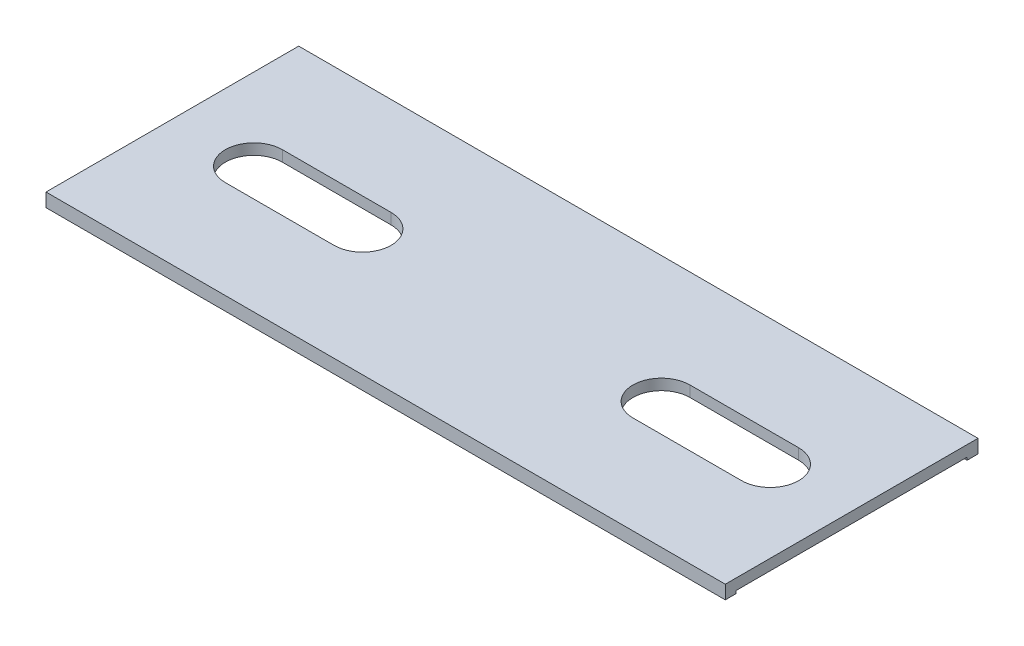
ISO-10303-21;
HEADER;
FILE_DESCRIPTION(('STEP AP214'),'2;1');
FILE_NAME('part.step','',(''),(''),'','','');
FILE_SCHEMA(('AUTOMOTIVE_DESIGN { 1 0 10303 214 1 1 1 1 }'));
ENDSEC;
DATA;
#1=APPLICATION_CONTEXT('core data for automotive mechanical design processes');
#2=APPLICATION_PROTOCOL_DEFINITION('international standard','automotive_design',2000,#1);
#3=PRODUCT_CONTEXT('',#1,'mechanical');
#4=PRODUCT('Part','Part','',(#3));
#5=PRODUCT_RELATED_PRODUCT_CATEGORY('part','',(#4));
#6=PRODUCT_DEFINITION_FORMATION('','',#4);
#7=PRODUCT_DEFINITION_CONTEXT('part definition',#1,'design');
#8=PRODUCT_DEFINITION('design','',#6,#7);
#9=PRODUCT_DEFINITION_SHAPE('','',#8);
#10=(LENGTH_UNIT() NAMED_UNIT(*) SI_UNIT(.MILLI.,.METRE.));
#11=(NAMED_UNIT(*) PLANE_ANGLE_UNIT() SI_UNIT($,.RADIAN.));
#12=(NAMED_UNIT(*) SI_UNIT($,.STERADIAN.) SOLID_ANGLE_UNIT());
#13=UNCERTAINTY_MEASURE_WITH_UNIT(LENGTH_MEASURE(1.E-05),#10,'distance_accuracy_value','');
#14=(GEOMETRIC_REPRESENTATION_CONTEXT(3) GLOBAL_UNCERTAINTY_ASSIGNED_CONTEXT((#13)) GLOBAL_UNIT_ASSIGNED_CONTEXT((#10,
#11,#12)) REPRESENTATION_CONTEXT('',''));
#15=CARTESIAN_POINT('',(0.,0.,0.));
#16=DIRECTION('',(0.,0.,1.));
#17=DIRECTION('',(1.,0.,0.));
#18=AXIS2_PLACEMENT_3D('',#15,#16,#17);
#19=CARTESIAN_POINT('',(63.5,0.,0.));
#20=DIRECTION('',(0.,0.,-1.));
#21=DIRECTION('',(0.,1.,0.));
#22=AXIS2_PLACEMENT_3D('',#19,#20,#21);
#23=PLANE('',#22);
#24=DIRECTION('',(0.,-1.,0.));
#25=VECTOR('',#24,1.);
#26=CARTESIAN_POINT('',(0.,0.,0.));
#27=LINE('',#26,#25);
#28=CARTESIAN_POINT('',(0.,0.,0.));
#29=VERTEX_POINT('',#28);
#30=CARTESIAN_POINT('',(0.,-1.27,0.));
#31=VERTEX_POINT('',#30);
#32=EDGE_CURVE('E252',#29,#31,#27,.T.);
#33=ORIENTED_EDGE('',*,*,#32,.T.);
#34=DIRECTION('',(-1.,0.,0.));
#35=VECTOR('',#34,1.);
#36=CARTESIAN_POINT('',(63.5,-1.27,0.));
#37=LINE('',#36,#35);
#38=CARTESIAN_POINT('',(63.5,-1.27,0.));
#39=VERTEX_POINT('',#38);
#40=EDGE_CURVE('E11',#39,#31,#37,.T.);
#41=ORIENTED_EDGE('',*,*,#40,.F.);
#42=DIRECTION('',(0.,-1.,0.));
#43=VECTOR('',#42,1.);
#44=CARTESIAN_POINT('',(63.5,0.,0.));
#45=LINE('',#44,#43);
#46=CARTESIAN_POINT('',(63.5,0.,0.));
#47=VERTEX_POINT('',#46);
#48=EDGE_CURVE('E255',#47,#39,#45,.T.);
#49=ORIENTED_EDGE('',*,*,#48,.F.);
#50=DIRECTION('',(-1.,0.,0.));
#51=VECTOR('',#50,1.);
#52=CARTESIAN_POINT('',(63.5,0.,0.));
#53=LINE('',#52,#51);
#54=EDGE_CURVE('E277',#47,#29,#53,.T.);
#55=ORIENTED_EDGE('',*,*,#54,.T.);
#56=EDGE_LOOP('',(#33,#41,#49,#55));
#57=FACE_BOUND('',#56,.T.);
#58=ADVANCED_FACE('F44',(#57),#23,.F.);
#59=CARTESIAN_POINT('',(63.5,-1.27,0.));
#60=DIRECTION('',(0.,1.,0.));
#61=DIRECTION('',(0.,0.,1.));
#62=AXIS2_PLACEMENT_3D('',#59,#60,#61);
#63=PLANE('',#62);
#64=DIRECTION('',(0.,0.,-1.));
#65=VECTOR('',#64,1.);
#66=CARTESIAN_POINT('',(0.,-1.27,0.));
#67=LINE('',#66,#65);
#68=CARTESIAN_POINT('',(0.,-1.27,-1.016));
#69=VERTEX_POINT('',#68);
#70=EDGE_CURVE('E285',#31,#69,#67,.T.);
#71=ORIENTED_EDGE('',*,*,#70,.T.);
#72=DIRECTION('',(-1.,0.,0.));
#73=VECTOR('',#72,1.);
#74=CARTESIAN_POINT('',(63.5,-1.27,-1.016));
#75=LINE('',#74,#73);
#76=CARTESIAN_POINT('',(63.5,-1.27,-1.016));
#77=VERTEX_POINT('',#76);
#78=EDGE_CURVE('E52',#77,#69,#75,.T.);
#79=ORIENTED_EDGE('',*,*,#78,.F.);
#80=DIRECTION('',(0.,0.,-1.));
#81=VECTOR('',#80,1.);
#82=CARTESIAN_POINT('',(63.5,-1.27,0.));
#83=LINE('',#82,#81);
#84=EDGE_CURVE('E258',#39,#77,#83,.T.);
#85=ORIENTED_EDGE('',*,*,#84,.F.);
#86=ORIENTED_EDGE('',*,*,#40,.T.);
#87=EDGE_LOOP('',(#71,#79,#85,#86));
#88=FACE_BOUND('',#87,.T.);
#89=ADVANCED_FACE('F351',(#88),#63,.F.);
#90=CARTESIAN_POINT('',(63.5,-1.27,-1.016));
#91=DIRECTION('',(0.,0.,1.));
#92=DIRECTION('',(1.,0.,0.));
#93=AXIS2_PLACEMENT_3D('',#90,#91,#92);
#94=PLANE('',#93);
#95=DIRECTION('',(0.,1.,0.));
#96=VECTOR('',#95,1.);
#97=CARTESIAN_POINT('',(0.,-1.27,-1.016));
#98=LINE('',#97,#96);
#99=CARTESIAN_POINT('',(0.,-1.016,-1.016));
#100=VERTEX_POINT('',#99);
#101=EDGE_CURVE('E283',#69,#100,#98,.T.);
#102=ORIENTED_EDGE('',*,*,#101,.T.);
#103=DIRECTION('',(-1.,0.,0.));
#104=VECTOR('',#103,1.);
#105=CARTESIAN_POINT('',(63.5,-1.016,-1.016));
#106=LINE('',#105,#104);
#107=CARTESIAN_POINT('',(63.5,-1.016,-1.016));
#108=VERTEX_POINT('',#107);
#109=EDGE_CURVE('E321',#108,#100,#106,.T.);
#110=ORIENTED_EDGE('',*,*,#109,.F.);
#111=DIRECTION('',(0.,1.,0.));
#112=VECTOR('',#111,1.);
#113=CARTESIAN_POINT('',(63.5,-1.27,-1.016));
#114=LINE('',#113,#112);
#115=EDGE_CURVE('E259',#77,#108,#114,.T.);
#116=ORIENTED_EDGE('',*,*,#115,.F.);
#117=ORIENTED_EDGE('',*,*,#78,.T.);
#118=EDGE_LOOP('',(#102,#110,#116,#117));
#119=FACE_BOUND('',#118,.T.);
#120=ADVANCED_FACE('F328',(#119),#94,.F.);
#121=CARTESIAN_POINT('',(63.5,-1.016,-1.016));
#122=DIRECTION('',(0.,1.,0.));
#123=DIRECTION('',(0.,0.,1.));
#124=AXIS2_PLACEMENT_3D('',#121,#122,#123);
#125=PLANE('',#124);
#126=DIRECTION('',(-1.,0.,0.));
#127=VECTOR('',#126,1.);
#128=CARTESIAN_POINT('',(63.5,-1.016,-14.478));
#129=LINE('',#128,#127);
#130=CARTESIAN_POINT('',(17.78,-1.016,-14.478));
#131=VERTEX_POINT('',#130);
#132=CARTESIAN_POINT('',(7.62,-1.016,-14.478));
#133=VERTEX_POINT('',#132);
#134=EDGE_CURVE('E243',#131,#133,#129,.T.);
#135=ORIENTED_EDGE('',*,*,#134,.T.);
#136=CARTESIAN_POINT('',(7.62,-1.016,-11.811));
#137=DIRECTION('',(0.,1.,0.));
#138=DIRECTION('',(0.,0.,1.));
#139=AXIS2_PLACEMENT_3D('',#136,#137,#138);
#140=CIRCLE('',#139,2.667);
#141=CARTESIAN_POINT('',(7.62,-1.016,-9.144));
#142=VERTEX_POINT('',#141);
#143=EDGE_CURVE('E250',#133,#142,#140,.T.);
#144=ORIENTED_EDGE('',*,*,#143,.T.);
#145=DIRECTION('',(1.,0.,0.));
#146=VECTOR('',#145,1.);
#147=CARTESIAN_POINT('',(63.5,-1.016,-9.144));
#148=LINE('',#147,#146);
#149=CARTESIAN_POINT('',(17.78,-1.016,-9.144));
#150=VERTEX_POINT('',#149);
#151=EDGE_CURVE('E239',#142,#150,#148,.T.);
#152=ORIENTED_EDGE('',*,*,#151,.T.);
#153=CARTESIAN_POINT('',(17.78,-1.016,-11.811));
#154=DIRECTION('',(0.,1.,0.));
#155=DIRECTION('',(0.,0.,1.));
#156=AXIS2_PLACEMENT_3D('',#153,#154,#155);
#157=CIRCLE('',#156,2.667);
#158=EDGE_CURVE('E163',#150,#131,#157,.T.);
#159=ORIENTED_EDGE('',*,*,#158,.T.);
#160=EDGE_LOOP('',(#135,#144,#152,#159));
#161=FACE_BOUND('',#160,.T.);
#162=DIRECTION('',(-1.,0.,0.));
#163=VECTOR('',#162,1.);
#164=CARTESIAN_POINT('',(63.5,-1.016,-14.478));
#165=LINE('',#164,#163);
#166=CARTESIAN_POINT('',(55.88,-1.016,-14.478));
#167=VERTEX_POINT('',#166);
#168=CARTESIAN_POINT('',(45.72,-1.016,-14.478));
#169=VERTEX_POINT('',#168);
#170=EDGE_CURVE('E229',#167,#169,#165,.T.);
#171=ORIENTED_EDGE('',*,*,#170,.T.);
#172=CARTESIAN_POINT('',(45.72,-1.016,-11.811));
#173=DIRECTION('',(0.,1.,0.));
#174=DIRECTION('',(0.,0.,1.));
#175=AXIS2_PLACEMENT_3D('',#172,#173,#174);
#176=CIRCLE('',#175,2.667);
#177=CARTESIAN_POINT('',(45.72,-1.016,-9.144));
#178=VERTEX_POINT('',#177);
#179=EDGE_CURVE('E233',#169,#178,#176,.T.);
#180=ORIENTED_EDGE('',*,*,#179,.T.);
#181=DIRECTION('',(1.,0.,0.));
#182=VECTOR('',#181,1.);
#183=CARTESIAN_POINT('',(63.5,-1.016,-9.144));
#184=LINE('',#183,#182);
#185=CARTESIAN_POINT('',(55.88,-1.016,-9.144));
#186=VERTEX_POINT('',#185);
#187=EDGE_CURVE('E195',#178,#186,#184,.T.);
#188=ORIENTED_EDGE('',*,*,#187,.T.);
#189=CARTESIAN_POINT('',(55.88,-1.016,-11.811));
#190=DIRECTION('',(0.,1.,0.));
#191=DIRECTION('',(0.,0.,1.));
#192=AXIS2_PLACEMENT_3D('',#189,#190,#191);
#193=CIRCLE('',#192,2.667);
#194=EDGE_CURVE('E226',#186,#167,#193,.T.);
#195=ORIENTED_EDGE('',*,*,#194,.T.);
#196=EDGE_LOOP('',(#171,#180,#188,#195));
#197=FACE_BOUND('',#196,.T.);
#198=DIRECTION('',(0.,0.,-1.));
#199=VECTOR('',#198,1.);
#200=CARTESIAN_POINT('',(0.,-1.016,-1.016));
#201=LINE('',#200,#199);
#202=CARTESIAN_POINT('',(0.,-1.016,-22.606));
#203=VERTEX_POINT('',#202);
#204=EDGE_CURVE('E288',#100,#203,#201,.T.);
#205=ORIENTED_EDGE('',*,*,#204,.T.);
#206=DIRECTION('',(-1.,0.,0.));
#207=VECTOR('',#206,1.);
#208=CARTESIAN_POINT('',(63.5,-1.016,-22.606));
#209=LINE('',#208,#207);
#210=CARTESIAN_POINT('',(63.5,-1.016,-22.606));
#211=VERTEX_POINT('',#210);
#212=EDGE_CURVE('E320',#211,#203,#209,.T.);
#213=ORIENTED_EDGE('',*,*,#212,.F.);
#214=DIRECTION('',(0.,0.,-1.));
#215=VECTOR('',#214,1.);
#216=CARTESIAN_POINT('',(63.5,-1.016,-1.016));
#217=LINE('',#216,#215);
#218=EDGE_CURVE('E261',#108,#211,#217,.T.);
#219=ORIENTED_EDGE('',*,*,#218,.F.);
#220=ORIENTED_EDGE('',*,*,#109,.T.);
#221=EDGE_LOOP('',(#205,#213,#219,#220));
#222=FACE_BOUND('',#221,.T.);
#223=ADVANCED_FACE('F342',(#161,#197,#222),#125,.F.);
#224=CARTESIAN_POINT('',(63.5,-1.016,-22.606));
#225=DIRECTION('',(0.,0.,-1.));
#226=DIRECTION('',(-1.,0.,0.));
#227=AXIS2_PLACEMENT_3D('',#224,#225,#226);
#228=PLANE('',#227);
#229=DIRECTION('',(0.,-1.,0.));
#230=VECTOR('',#229,1.);
#231=CARTESIAN_POINT('',(0.,-1.016,-22.606));
#232=LINE('',#231,#230);
#233=CARTESIAN_POINT('',(0.,-1.27,-22.606));
#234=VERTEX_POINT('',#233);
#235=EDGE_CURVE('E292',#203,#234,#232,.T.);
#236=ORIENTED_EDGE('',*,*,#235,.T.);
#237=DIRECTION('',(-1.,0.,0.));
#238=VECTOR('',#237,1.);
#239=CARTESIAN_POINT('',(63.5,-1.27,-22.606));
#240=LINE('',#239,#238);
#241=CARTESIAN_POINT('',(63.5,-1.27,-22.606));
#242=VERTEX_POINT('',#241);
#243=EDGE_CURVE('E313',#242,#234,#240,.T.);
#244=ORIENTED_EDGE('',*,*,#243,.F.);
#245=DIRECTION('',(0.,-1.,0.));
#246=VECTOR('',#245,1.);
#247=CARTESIAN_POINT('',(63.5,-1.016,-22.606));
#248=LINE('',#247,#246);
#249=EDGE_CURVE('E266',#211,#242,#248,.T.);
#250=ORIENTED_EDGE('',*,*,#249,.F.);
#251=ORIENTED_EDGE('',*,*,#212,.T.);
#252=EDGE_LOOP('',(#236,#244,#250,#251));
#253=FACE_BOUND('',#252,.T.);
#254=ADVANCED_FACE('F341',(#253),#228,.F.);
#255=CARTESIAN_POINT('',(63.5,-1.27,-22.606));
#256=DIRECTION('',(0.,1.,0.));
#257=DIRECTION('',(0.,0.,1.));
#258=AXIS2_PLACEMENT_3D('',#255,#256,#257);
#259=PLANE('',#258);
#260=DIRECTION('',(0.,0.,-1.));
#261=VECTOR('',#260,1.);
#262=CARTESIAN_POINT('',(0.,-1.27,-22.606));
#263=LINE('',#262,#261);
#264=CARTESIAN_POINT('',(0.,-1.27,-23.622));
#265=VERTEX_POINT('',#264);
#266=EDGE_CURVE('E294',#234,#265,#263,.T.);
#267=ORIENTED_EDGE('',*,*,#266,.T.);
#268=DIRECTION('',(-1.,0.,0.));
#269=VECTOR('',#268,1.);
#270=CARTESIAN_POINT('',(63.5,-1.27,-23.622));
#271=LINE('',#270,#269);
#272=CARTESIAN_POINT('',(63.5,-1.27,-23.622));
#273=VERTEX_POINT('',#272);
#274=EDGE_CURVE('E309',#273,#265,#271,.T.);
#275=ORIENTED_EDGE('',*,*,#274,.F.);
#276=DIRECTION('',(0.,0.,-1.));
#277=VECTOR('',#276,1.);
#278=CARTESIAN_POINT('',(63.5,-1.27,-22.606));
#279=LINE('',#278,#277);
#280=EDGE_CURVE('E267',#242,#273,#279,.T.);
#281=ORIENTED_EDGE('',*,*,#280,.F.);
#282=ORIENTED_EDGE('',*,*,#243,.T.);
#283=EDGE_LOOP('',(#267,#275,#281,#282));
#284=FACE_BOUND('',#283,.T.);
#285=ADVANCED_FACE('F364',(#284),#259,.F.);
#286=CARTESIAN_POINT('',(63.5,0.,-23.622));
#287=DIRECTION('',(0.,0.,1.));
#288=DIRECTION('',(1.,0.,0.));
#289=AXIS2_PLACEMENT_3D('',#286,#287,#288);
#290=PLANE('',#289);
#291=DIRECTION('',(0.,1.,0.));
#292=VECTOR('',#291,1.);
#293=CARTESIAN_POINT('',(0.,0.,-23.622));
#294=LINE('',#293,#292);
#295=CARTESIAN_POINT('',(0.,0.,-23.622));
#296=VERTEX_POINT('',#295);
#297=EDGE_CURVE('E300',#265,#296,#294,.T.);
#298=ORIENTED_EDGE('',*,*,#297,.T.);
#299=DIRECTION('',(-1.,0.,0.));
#300=VECTOR('',#299,1.);
#301=CARTESIAN_POINT('',(63.5,0.,-23.622));
#302=LINE('',#301,#300);
#303=CARTESIAN_POINT('',(63.5,0.,-23.622));
#304=VERTEX_POINT('',#303);
#305=EDGE_CURVE('E304',#304,#296,#302,.T.);
#306=ORIENTED_EDGE('',*,*,#305,.F.);
#307=DIRECTION('',(0.,1.,0.));
#308=VECTOR('',#307,1.);
#309=CARTESIAN_POINT('',(63.5,0.,-23.622));
#310=LINE('',#309,#308);
#311=EDGE_CURVE('E275',#273,#304,#310,.T.);
#312=ORIENTED_EDGE('',*,*,#311,.F.);
#313=ORIENTED_EDGE('',*,*,#274,.T.);
#314=EDGE_LOOP('',(#298,#306,#312,#313));
#315=FACE_BOUND('',#314,.T.);
#316=ADVANCED_FACE('F363',(#315),#290,.F.);
#317=CARTESIAN_POINT('',(63.5,0.,0.));
#318=DIRECTION('',(0.,-1.,0.));
#319=DIRECTION('',(0.,0.,-1.));
#320=AXIS2_PLACEMENT_3D('',#317,#318,#319);
#321=PLANE('',#320);
#322=DIRECTION('',(1.,0.,0.));
#323=VECTOR('',#322,1.);
#324=CARTESIAN_POINT('',(7.62,0.,-9.144));
#325=LINE('',#324,#323);
#326=CARTESIAN_POINT('',(7.62,0.,-9.144));
#327=VERTEX_POINT('',#326);
#328=CARTESIAN_POINT('',(17.78,0.,-9.144));
#329=VERTEX_POINT('',#328);
#330=EDGE_CURVE('E173',#327,#329,#325,.T.);
#331=ORIENTED_EDGE('',*,*,#330,.F.);
#332=CARTESIAN_POINT('',(7.62,0.,-11.811));
#333=DIRECTION('',(0.,1.,0.));
#334=DIRECTION('',(0.,0.,1.));
#335=AXIS2_PLACEMENT_3D('',#332,#333,#334);
#336=CIRCLE('',#335,2.667);
#337=CARTESIAN_POINT('',(7.62,0.,-14.478));
#338=VERTEX_POINT('',#337);
#339=EDGE_CURVE('E180',#338,#327,#336,.T.);
#340=ORIENTED_EDGE('',*,*,#339,.F.);
#341=DIRECTION('',(-1.,0.,0.));
#342=VECTOR('',#341,1.);
#343=CARTESIAN_POINT('',(7.62,0.,-14.478));
#344=LINE('',#343,#342);
#345=CARTESIAN_POINT('',(17.78,0.,-14.478));
#346=VERTEX_POINT('',#345);
#347=EDGE_CURVE('E185',#346,#338,#344,.T.);
#348=ORIENTED_EDGE('',*,*,#347,.F.);
#349=CARTESIAN_POINT('',(17.78,0.,-11.811));
#350=DIRECTION('',(0.,1.,0.));
#351=DIRECTION('',(0.,0.,1.));
#352=AXIS2_PLACEMENT_3D('',#349,#350,#351);
#353=CIRCLE('',#352,2.667);
#354=EDGE_CURVE('E158',#329,#346,#353,.T.);
#355=ORIENTED_EDGE('',*,*,#354,.F.);
#356=EDGE_LOOP('',(#331,#340,#348,#355));
#357=FACE_BOUND('',#356,.T.);
#358=DIRECTION('',(1.,0.,0.));
#359=VECTOR('',#358,1.);
#360=CARTESIAN_POINT('',(45.72,0.,-9.144));
#361=LINE('',#360,#359);
#362=CARTESIAN_POINT('',(45.72,0.,-9.144));
#363=VERTEX_POINT('',#362);
#364=CARTESIAN_POINT('',(55.88,0.,-9.144));
#365=VERTEX_POINT('',#364);
#366=EDGE_CURVE('E220',#363,#365,#361,.T.);
#367=ORIENTED_EDGE('',*,*,#366,.F.);
#368=CARTESIAN_POINT('',(45.72,0.,-11.811));
#369=DIRECTION('',(0.,1.,0.));
#370=DIRECTION('',(0.,0.,1.));
#371=AXIS2_PLACEMENT_3D('',#368,#369,#370);
#372=CIRCLE('',#371,2.667);
#373=CARTESIAN_POINT('',(45.72,0.,-14.478));
#374=VERTEX_POINT('',#373);
#375=EDGE_CURVE('E217',#374,#363,#372,.T.);
#376=ORIENTED_EDGE('',*,*,#375,.F.);
#377=DIRECTION('',(-1.,0.,0.));
#378=VECTOR('',#377,1.);
#379=CARTESIAN_POINT('',(45.72,0.,-14.478));
#380=LINE('',#379,#378);
#381=CARTESIAN_POINT('',(55.88,0.,-14.478));
#382=VERTEX_POINT('',#381);
#383=EDGE_CURVE('E202',#382,#374,#380,.T.);
#384=ORIENTED_EDGE('',*,*,#383,.F.);
#385=CARTESIAN_POINT('',(55.88,0.,-11.811));
#386=DIRECTION('',(0.,1.,0.));
#387=DIRECTION('',(0.,0.,1.));
#388=AXIS2_PLACEMENT_3D('',#385,#386,#387);
#389=CIRCLE('',#388,2.667);
#390=EDGE_CURVE('E211',#365,#382,#389,.T.);
#391=ORIENTED_EDGE('',*,*,#390,.F.);
#392=EDGE_LOOP('',(#367,#376,#384,#391));
#393=FACE_BOUND('',#392,.T.);
#394=DIRECTION('',(0.,0.,1.));
#395=VECTOR('',#394,1.);
#396=CARTESIAN_POINT('',(0.,0.,0.));
#397=LINE('',#396,#395);
#398=EDGE_CURVE('E257',#296,#29,#397,.T.);
#399=ORIENTED_EDGE('',*,*,#398,.T.);
#400=ORIENTED_EDGE('',*,*,#54,.F.);
#401=DIRECTION('',(0.,0.,1.));
#402=VECTOR('',#401,1.);
#403=CARTESIAN_POINT('',(63.5,0.,0.));
#404=LINE('',#403,#402);
#405=EDGE_CURVE('E274',#304,#47,#404,.T.);
#406=ORIENTED_EDGE('',*,*,#405,.F.);
#407=ORIENTED_EDGE('',*,*,#305,.T.);
#408=EDGE_LOOP('',(#399,#400,#406,#407));
#409=FACE_BOUND('',#408,.T.);
#410=ADVANCED_FACE('F177',(#357,#393,#409),#321,.F.);
#411=CARTESIAN_POINT('',(63.5,0.,0.));
#412=DIRECTION('',(1.,0.,0.));
#413=DIRECTION('',(0.,0.,-1.));
#414=AXIS2_PLACEMENT_3D('',#411,#412,#413);
#415=PLANE('',#414);
#416=ORIENTED_EDGE('',*,*,#48,.T.);
#417=ORIENTED_EDGE('',*,*,#84,.T.);
#418=ORIENTED_EDGE('',*,*,#115,.T.);
#419=ORIENTED_EDGE('',*,*,#218,.T.);
#420=ORIENTED_EDGE('',*,*,#249,.T.);
#421=ORIENTED_EDGE('',*,*,#280,.T.);
#422=ORIENTED_EDGE('',*,*,#311,.T.);
#423=ORIENTED_EDGE('',*,*,#405,.T.);
#424=EDGE_LOOP('',(#416,#417,#418,#419,#420,#421,#422,#423));
#425=FACE_BOUND('',#424,.T.);
#426=ADVANCED_FACE('F350',(#425),#415,.T.);
#427=CARTESIAN_POINT('',(0.,0.,0.));
#428=DIRECTION('',(1.,0.,0.));
#429=DIRECTION('',(0.,0.,-1.));
#430=AXIS2_PLACEMENT_3D('',#427,#428,#429);
#431=PLANE('',#430);
#432=ORIENTED_EDGE('',*,*,#32,.F.);
#433=ORIENTED_EDGE('',*,*,#398,.F.);
#434=ORIENTED_EDGE('',*,*,#297,.F.);
#435=ORIENTED_EDGE('',*,*,#266,.F.);
#436=ORIENTED_EDGE('',*,*,#235,.F.);
#437=ORIENTED_EDGE('',*,*,#204,.F.);
#438=ORIENTED_EDGE('',*,*,#101,.F.);
#439=ORIENTED_EDGE('',*,*,#70,.F.);
#440=EDGE_LOOP('',(#432,#433,#434,#435,#436,#437,#438,#439));
#441=FACE_BOUND('',#440,.T.);
#442=ADVANCED_FACE('F337',(#441),#431,.F.);
#443=CARTESIAN_POINT('',(45.72,-1.27,-11.811));
#444=DIRECTION('',(0.,1.,0.));
#445=DIRECTION('',(0.,0.,1.));
#446=AXIS2_PLACEMENT_3D('',#443,#444,#445);
#447=CYLINDRICAL_SURFACE('',#446,2.667);
#448=DIRECTION('',(0.,1.,0.));
#449=VECTOR('',#448,1.);
#450=CARTESIAN_POINT('',(45.72,-1.27,-14.478));
#451=LINE('',#450,#449);
#452=EDGE_CURVE('E210',#169,#374,#451,.T.);
#453=ORIENTED_EDGE('',*,*,#452,.T.);
#454=ORIENTED_EDGE('',*,*,#375,.T.);
#455=DIRECTION('',(0.,1.,0.));
#456=VECTOR('',#455,1.);
#457=CARTESIAN_POINT('',(45.72,-1.27,-9.144));
#458=LINE('',#457,#456);
#459=EDGE_CURVE('E200',#178,#363,#458,.T.);
#460=ORIENTED_EDGE('',*,*,#459,.F.);
#461=ORIENTED_EDGE('',*,*,#179,.F.);
#462=EDGE_LOOP('',(#453,#454,#460,#461));
#463=FACE_BOUND('',#462,.T.);
#464=ADVANCED_FACE('F405',(#463),#447,.F.);
#465=CARTESIAN_POINT('',(45.72,-1.27,-14.478));
#466=DIRECTION('',(0.,0.,-1.));
#467=DIRECTION('',(-1.,0.,0.));
#468=AXIS2_PLACEMENT_3D('',#465,#466,#467);
#469=PLANE('',#468);
#470=DIRECTION('',(0.,1.,0.));
#471=VECTOR('',#470,1.);
#472=CARTESIAN_POINT('',(55.88,-1.27,-14.478));
#473=LINE('',#472,#471);
#474=EDGE_CURVE('E204',#167,#382,#473,.T.);
#475=ORIENTED_EDGE('',*,*,#474,.T.);
#476=ORIENTED_EDGE('',*,*,#383,.T.);
#477=ORIENTED_EDGE('',*,*,#452,.F.);
#478=ORIENTED_EDGE('',*,*,#170,.F.);
#479=EDGE_LOOP('',(#475,#476,#477,#478));
#480=FACE_BOUND('',#479,.T.);
#481=ADVANCED_FACE('F391',(#480),#469,.F.);
#482=CARTESIAN_POINT('',(55.88,-1.27,-11.811));
#483=DIRECTION('',(0.,1.,0.));
#484=DIRECTION('',(0.,0.,1.));
#485=AXIS2_PLACEMENT_3D('',#482,#483,#484);
#486=CYLINDRICAL_SURFACE('',#485,2.667);
#487=DIRECTION('',(0.,1.,0.));
#488=VECTOR('',#487,1.);
#489=CARTESIAN_POINT('',(55.88,-1.27,-9.144));
#490=LINE('',#489,#488);
#491=EDGE_CURVE('E66',#186,#365,#490,.T.);
#492=ORIENTED_EDGE('',*,*,#491,.T.);
#493=ORIENTED_EDGE('',*,*,#390,.T.);
#494=ORIENTED_EDGE('',*,*,#474,.F.);
#495=ORIENTED_EDGE('',*,*,#194,.F.);
#496=EDGE_LOOP('',(#492,#493,#494,#495));
#497=FACE_BOUND('',#496,.T.);
#498=ADVANCED_FACE('F394',(#497),#486,.F.);
#499=CARTESIAN_POINT('',(45.72,-1.27,-9.144));
#500=DIRECTION('',(0.,0.,1.));
#501=DIRECTION('',(1.,0.,0.));
#502=AXIS2_PLACEMENT_3D('',#499,#500,#501);
#503=PLANE('',#502);
#504=ORIENTED_EDGE('',*,*,#459,.T.);
#505=ORIENTED_EDGE('',*,*,#366,.T.);
#506=ORIENTED_EDGE('',*,*,#491,.F.);
#507=ORIENTED_EDGE('',*,*,#187,.F.);
#508=EDGE_LOOP('',(#504,#505,#506,#507));
#509=FACE_BOUND('',#508,.T.);
#510=ADVANCED_FACE('F403',(#509),#503,.F.);
#511=CARTESIAN_POINT('',(7.62,-1.27,-11.811));
#512=DIRECTION('',(0.,1.,0.));
#513=DIRECTION('',(0.,0.,1.));
#514=AXIS2_PLACEMENT_3D('',#511,#512,#513);
#515=CYLINDRICAL_SURFACE('',#514,2.667);
#516=DIRECTION('',(0.,1.,0.));
#517=VECTOR('',#516,1.);
#518=CARTESIAN_POINT('',(7.62,-1.27,-14.478));
#519=LINE('',#518,#517);
#520=EDGE_CURVE('E188',#133,#338,#519,.T.);
#521=ORIENTED_EDGE('',*,*,#520,.T.);
#522=ORIENTED_EDGE('',*,*,#339,.T.);
#523=DIRECTION('',(0.,1.,0.));
#524=VECTOR('',#523,1.);
#525=CARTESIAN_POINT('',(7.62,-1.27,-9.144));
#526=LINE('',#525,#524);
#527=EDGE_CURVE('E167',#142,#327,#526,.T.);
#528=ORIENTED_EDGE('',*,*,#527,.F.);
#529=ORIENTED_EDGE('',*,*,#143,.F.);
#530=EDGE_LOOP('',(#521,#522,#528,#529));
#531=FACE_BOUND('',#530,.T.);
#532=ADVANCED_FACE('F404',(#531),#515,.F.);
#533=CARTESIAN_POINT('',(7.62,-1.27,-14.478));
#534=DIRECTION('',(0.,0.,-1.));
#535=DIRECTION('',(-1.,0.,0.));
#536=AXIS2_PLACEMENT_3D('',#533,#534,#535);
#537=PLANE('',#536);
#538=DIRECTION('',(0.,1.,0.));
#539=VECTOR('',#538,1.);
#540=CARTESIAN_POINT('',(17.78,-1.27,-14.478));
#541=LINE('',#540,#539);
#542=EDGE_CURVE('E168',#131,#346,#541,.T.);
#543=ORIENTED_EDGE('',*,*,#542,.T.);
#544=ORIENTED_EDGE('',*,*,#347,.T.);
#545=ORIENTED_EDGE('',*,*,#520,.F.);
#546=ORIENTED_EDGE('',*,*,#134,.F.);
#547=EDGE_LOOP('',(#543,#544,#545,#546));
#548=FACE_BOUND('',#547,.T.);
#549=ADVANCED_FACE('F411',(#548),#537,.F.);
#550=CARTESIAN_POINT('',(17.78,-1.27,-11.811));
#551=DIRECTION('',(0.,1.,0.));
#552=DIRECTION('',(0.,0.,1.));
#553=AXIS2_PLACEMENT_3D('',#550,#551,#552);
#554=CYLINDRICAL_SURFACE('',#553,2.667);
#555=DIRECTION('',(0.,1.,0.));
#556=VECTOR('',#555,1.);
#557=CARTESIAN_POINT('',(17.78,-1.27,-9.144));
#558=LINE('',#557,#556);
#559=EDGE_CURVE('E58',#150,#329,#558,.T.);
#560=ORIENTED_EDGE('',*,*,#559,.T.);
#561=ORIENTED_EDGE('',*,*,#354,.T.);
#562=ORIENTED_EDGE('',*,*,#542,.F.);
#563=ORIENTED_EDGE('',*,*,#158,.F.);
#564=EDGE_LOOP('',(#560,#561,#562,#563));
#565=FACE_BOUND('',#564,.T.);
#566=ADVANCED_FACE('F160',(#565),#554,.F.);
#567=CARTESIAN_POINT('',(7.62,-1.27,-9.144));
#568=DIRECTION('',(0.,0.,1.));
#569=DIRECTION('',(1.,0.,0.));
#570=AXIS2_PLACEMENT_3D('',#567,#568,#569);
#571=PLANE('',#570);
#572=ORIENTED_EDGE('',*,*,#527,.T.);
#573=ORIENTED_EDGE('',*,*,#330,.T.);
#574=ORIENTED_EDGE('',*,*,#559,.F.);
#575=ORIENTED_EDGE('',*,*,#151,.F.);
#576=EDGE_LOOP('',(#572,#573,#574,#575));
#577=FACE_BOUND('',#576,.T.);
#578=ADVANCED_FACE('F175',(#577),#571,.F.);
#579=CLOSED_SHELL('',(#58,#89,#120,#223,#254,#285,#316,#410,#426,#442,#464,#481,#498,#510,#532,
#549,#566,#578));
#580=MANIFOLD_SOLID_BREP('B2',#579);
#581=ADVANCED_BREP_SHAPE_REPRESENTATION('',(#18,#580),#14);
#582=SHAPE_DEFINITION_REPRESENTATION(#9,#581);
ENDSEC;
END-ISO-10303-21;
